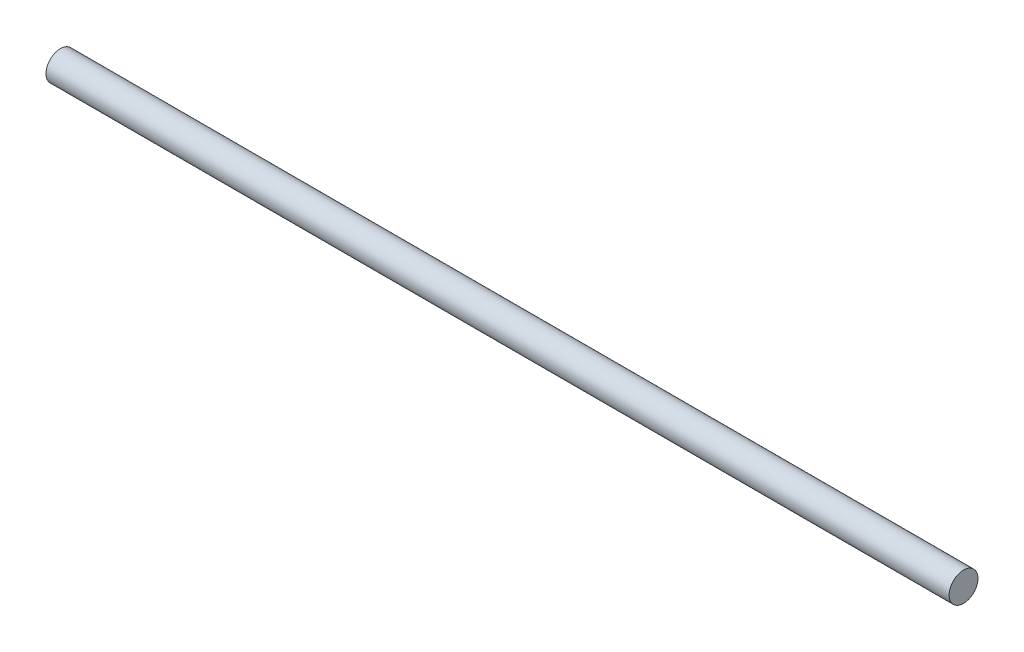
ISO-10303-21;
HEADER;
FILE_DESCRIPTION(('STEP AP214'),'2;1');
FILE_NAME('part.step','',(''),(''),'','','');
FILE_SCHEMA(('AUTOMOTIVE_DESIGN { 1 0 10303 214 1 1 1 1 }'));
ENDSEC;
DATA;
#1=APPLICATION_CONTEXT('core data for automotive mechanical design processes');
#2=APPLICATION_PROTOCOL_DEFINITION('international standard','automotive_design',2000,#1);
#3=PRODUCT_CONTEXT('',#1,'mechanical');
#4=PRODUCT('Part','Part','',(#3));
#5=PRODUCT_RELATED_PRODUCT_CATEGORY('part','',(#4));
#6=PRODUCT_DEFINITION_FORMATION('','',#4);
#7=PRODUCT_DEFINITION_CONTEXT('part definition',#1,'design');
#8=PRODUCT_DEFINITION('design','',#6,#7);
#9=PRODUCT_DEFINITION_SHAPE('','',#8);
#10=(LENGTH_UNIT() NAMED_UNIT(*) SI_UNIT(.MILLI.,.METRE.));
#11=(NAMED_UNIT(*) PLANE_ANGLE_UNIT() SI_UNIT($,.RADIAN.));
#12=(NAMED_UNIT(*) SI_UNIT($,.STERADIAN.) SOLID_ANGLE_UNIT());
#13=UNCERTAINTY_MEASURE_WITH_UNIT(LENGTH_MEASURE(1.E-05),#10,'distance_accuracy_value','');
#14=(GEOMETRIC_REPRESENTATION_CONTEXT(3) GLOBAL_UNCERTAINTY_ASSIGNED_CONTEXT((#13)) GLOBAL_UNIT_ASSIGNED_CONTEXT((#10,
#11,#12)) REPRESENTATION_CONTEXT('',''));
#15=CARTESIAN_POINT('',(0.,0.,0.));
#16=DIRECTION('',(0.,0.,1.));
#17=DIRECTION('',(1.,0.,0.));
#18=AXIS2_PLACEMENT_3D('',#15,#16,#17);
#19=CARTESIAN_POINT('',(250.,0.,0.));
#20=DIRECTION('',(-1.,0.,0.));
#21=DIRECTION('',(0.,0.,1.));
#22=AXIS2_PLACEMENT_3D('',#19,#20,#21);
#23=CYLINDRICAL_SURFACE('',#22,4.);
#24=CARTESIAN_POINT('',(250.,0.,0.));
#25=DIRECTION('',(1.,0.,0.));
#26=DIRECTION('',(0.,0.,-1.));
#27=AXIS2_PLACEMENT_3D('',#24,#25,#26);
#28=CIRCLE('',#27,4.);
#29=CARTESIAN_POINT('',(250.,0.,-4.));
#30=VERTEX_POINT('',#29);
#31=EDGE_CURVE('E10',#30,#30,#28,.T.);
#32=ORIENTED_EDGE('',*,*,#31,.F.);
#33=EDGE_LOOP('',(#32));
#34=FACE_BOUND('',#33,.T.);
#35=CARTESIAN_POINT('',(0.,0.,0.));
#36=DIRECTION('',(1.,0.,0.));
#37=DIRECTION('',(0.,0.,-1.));
#38=AXIS2_PLACEMENT_3D('',#35,#36,#37);
#39=CIRCLE('',#38,4.);
#40=CARTESIAN_POINT('',(0.,0.,-4.));
#41=VERTEX_POINT('',#40);
#42=EDGE_CURVE('E35',#41,#41,#39,.T.);
#43=ORIENTED_EDGE('',*,*,#42,.T.);
#44=EDGE_LOOP('',(#43));
#45=FACE_BOUND('',#44,.T.);
#46=ADVANCED_FACE('F32',(#34,#45),#23,.T.);
#47=CARTESIAN_POINT('',(250.,0.,0.));
#48=DIRECTION('',(1.,0.,0.));
#49=DIRECTION('',(0.,0.,-1.));
#50=AXIS2_PLACEMENT_3D('',#47,#48,#49);
#51=PLANE('',#50);
#52=ORIENTED_EDGE('',*,*,#31,.T.);
#53=EDGE_LOOP('',(#52));
#54=FACE_BOUND('',#53,.T.);
#55=ADVANCED_FACE('F47',(#54),#51,.T.);
#56=CARTESIAN_POINT('',(0.,0.,0.));
#57=DIRECTION('',(1.,0.,0.));
#58=DIRECTION('',(0.,0.,-1.));
#59=AXIS2_PLACEMENT_3D('',#56,#57,#58);
#60=PLANE('',#59);
#61=ORIENTED_EDGE('',*,*,#42,.F.);
#62=EDGE_LOOP('',(#61));
#63=FACE_BOUND('',#62,.T.);
#64=ADVANCED_FACE('F45',(#63),#60,.F.);
#65=CLOSED_SHELL('',(#46,#55,#64));
#66=MANIFOLD_SOLID_BREP('B2',#65);
#67=ADVANCED_BREP_SHAPE_REPRESENTATION('',(#18,#66),#14);
#68=SHAPE_DEFINITION_REPRESENTATION(#9,#67);
ENDSEC;
END-ISO-10303-21;
